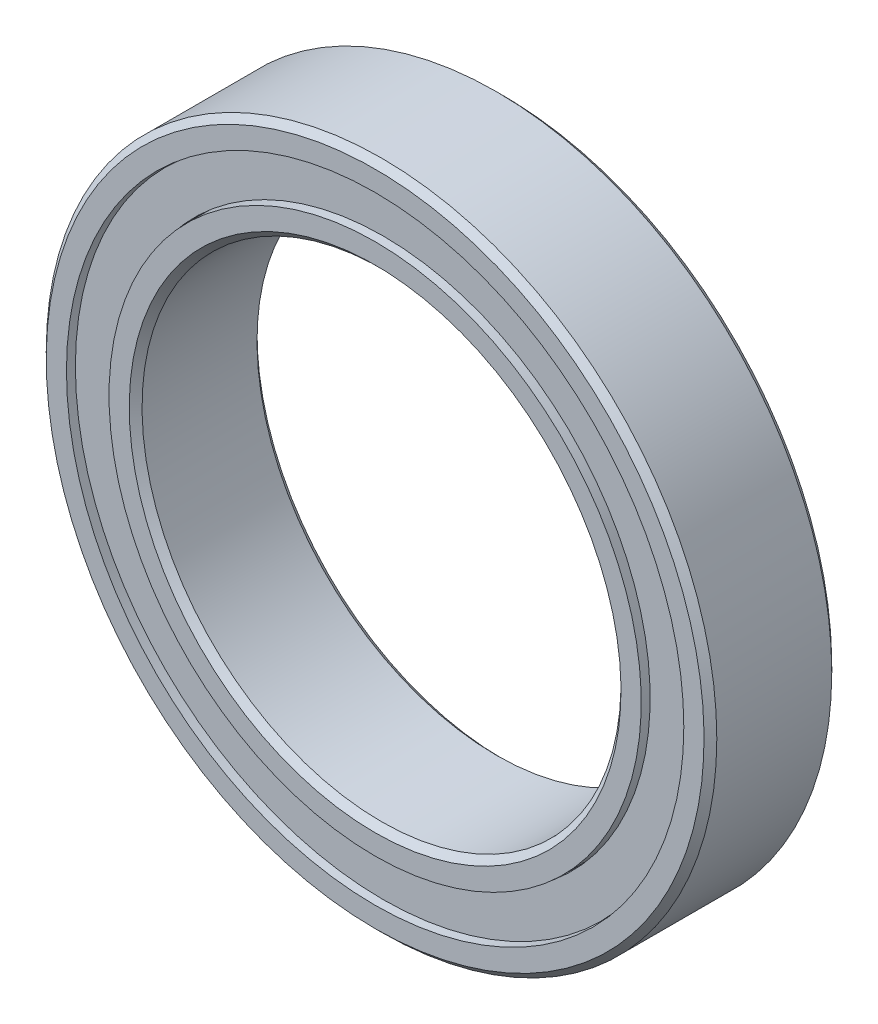
ISO-10303-21;
HEADER;
FILE_DESCRIPTION(('STEP AP214'),'2;1');
FILE_NAME('part.step','',(''),(''),'','','');
FILE_SCHEMA(('AUTOMOTIVE_DESIGN { 1 0 10303 214 1 1 1 1 }'));
ENDSEC;
DATA;
#1=APPLICATION_CONTEXT('core data for automotive mechanical design processes');
#2=APPLICATION_PROTOCOL_DEFINITION('international standard','automotive_design',2000,#1);
#3=PRODUCT_CONTEXT('',#1,'mechanical');
#4=PRODUCT('Part','Part','',(#3));
#5=PRODUCT_RELATED_PRODUCT_CATEGORY('part','',(#4));
#6=PRODUCT_DEFINITION_FORMATION('','',#4);
#7=PRODUCT_DEFINITION_CONTEXT('part definition',#1,'design');
#8=PRODUCT_DEFINITION('design','',#6,#7);
#9=PRODUCT_DEFINITION_SHAPE('','',#8);
#10=(LENGTH_UNIT() NAMED_UNIT(*) SI_UNIT(.MILLI.,.METRE.));
#11=(NAMED_UNIT(*) PLANE_ANGLE_UNIT() SI_UNIT($,.RADIAN.));
#12=(NAMED_UNIT(*) SI_UNIT($,.STERADIAN.) SOLID_ANGLE_UNIT());
#13=UNCERTAINTY_MEASURE_WITH_UNIT(LENGTH_MEASURE(1.E-05),#10,'distance_accuracy_value','');
#14=(GEOMETRIC_REPRESENTATION_CONTEXT(3) GLOBAL_UNCERTAINTY_ASSIGNED_CONTEXT((#13)) GLOBAL_UNIT_ASSIGNED_CONTEXT((#10,
#11,#12)) REPRESENTATION_CONTEXT('',''));
#15=CARTESIAN_POINT('',(0.,0.,0.));
#16=DIRECTION('',(0.,0.,1.));
#17=DIRECTION('',(1.,0.,0.));
#18=AXIS2_PLACEMENT_3D('',#15,#16,#17);
#19=CARTESIAN_POINT('',(3.90495365205792,8.10871981112182,0.));
#20=DIRECTION('',(0.,0.,1.));
#21=DIRECTION('',(0.433883739117546,0.900968867902425,0.));
#22=AXIS2_PLACEMENT_3D('',#19,#20,#21);
#23=SPHERICAL_SURFACE('',#22,1.11111111111111);
#24=CARTESIAN_POINT('',(3.90495365205792,8.10871981112182,1.11111111111111));
#25=VERTEX_POINT('',#24);
#26=VERTEX_LOOP('',#25);
#27=FACE_BOUND('',#26,.T.);
#28=ADVANCED_FACE('F37',(#27),#23,.T.);
#29=CLOSED_SHELL('',(#28));
#30=MANIFOLD_SOLID_BREP('B2',#29);
#31=CARTESIAN_POINT('',(7.0364833422122,5.61140821672869,0.));
#32=DIRECTION('',(0.,0.,1.));
#33=DIRECTION('',(0.781831482468022,0.623489801858743,0.));
#34=AXIS2_PLACEMENT_3D('',#31,#32,#33);
#35=SPHERICAL_SURFACE('',#34,1.11111111111111);
#36=CARTESIAN_POINT('',(7.0364833422122,5.61140821672869,1.11111111111111));
#37=VERTEX_POINT('',#36);
#38=VERTEX_LOOP('',#37);
#39=FACE_BOUND('',#38,.T.);
#40=ADVANCED_FACE('F57',(#39),#35,.T.);
#41=CLOSED_SHELL('',(#40));
#42=MANIFOLD_SOLID_BREP('B6',#41);
#43=CARTESIAN_POINT('',(8.77435120963639,2.00268840560692,0.));
#44=DIRECTION('',(0.,0.,1.));
#45=DIRECTION('',(0.974927912181821,0.222520933956325,0.));
#46=AXIS2_PLACEMENT_3D('',#43,#44,#45);
#47=SPHERICAL_SURFACE('',#46,1.11111111111111);
#48=CARTESIAN_POINT('',(8.77435120963639,2.00268840560692,1.11111111111111));
#49=VERTEX_POINT('',#48);
#50=VERTEX_LOOP('',#49);
#51=FACE_BOUND('',#50,.T.);
#52=ADVANCED_FACE('F77',(#51),#47,.T.);
#53=CLOSED_SHELL('',(#52));
#54=MANIFOLD_SOLID_BREP('B33',#53);
#55=CARTESIAN_POINT('',(8.77435120963643,-2.00268840560675,0.));
#56=DIRECTION('',(0.,0.,1.));
#57=DIRECTION('',(0.974927912181826,-0.222520933956305,0.));
#58=AXIS2_PLACEMENT_3D('',#55,#56,#57);
#59=SPHERICAL_SURFACE('',#58,1.11111111111111);
#60=CARTESIAN_POINT('',(8.77435120963643,-2.00268840560675,1.11111111111111));
#61=VERTEX_POINT('',#60);
#62=VERTEX_LOOP('',#61);
#63=FACE_BOUND('',#62,.T.);
#64=ADVANCED_FACE('F97',(#63),#59,.T.);
#65=CLOSED_SHELL('',(#64));
#66=MANIFOLD_SOLID_BREP('B53',#65);
#67=CARTESIAN_POINT('',(7.03648334221232,-5.61140821672854,0.));
#68=DIRECTION('',(0.,0.,1.));
#69=DIRECTION('',(0.781831482468035,-0.623489801858727,0.));
#70=AXIS2_PLACEMENT_3D('',#67,#68,#69);
#71=SPHERICAL_SURFACE('',#70,1.11111111111111);
#72=CARTESIAN_POINT('',(7.03648334221232,-5.61140821672854,1.11111111111111));
#73=VERTEX_POINT('',#72);
#74=VERTEX_LOOP('',#73);
#75=FACE_BOUND('',#74,.T.);
#76=ADVANCED_FACE('F117',(#75),#71,.T.);
#77=CLOSED_SHELL('',(#76));
#78=MANIFOLD_SOLID_BREP('B73',#77);
#79=CARTESIAN_POINT('',(3.90495365205809,-8.10871981112174,0.));
#80=DIRECTION('',(0.,0.,1.));
#81=DIRECTION('',(0.433883739117565,-0.900968867902416,0.));
#82=AXIS2_PLACEMENT_3D('',#79,#80,#81);
#83=SPHERICAL_SURFACE('',#82,1.11111111111111);
#84=CARTESIAN_POINT('',(3.90495365205809,-8.10871981112174,1.11111111111111));
#85=VERTEX_POINT('',#84);
#86=VERTEX_LOOP('',#85);
#87=FACE_BOUND('',#86,.T.);
#88=ADVANCED_FACE('F137',(#87),#83,.T.);
#89=CLOSED_SHELL('',(#88));
#90=MANIFOLD_SOLID_BREP('B93',#89);
#91=CARTESIAN_POINT('',(0.,-9.,0.));
#92=DIRECTION('',(0.,0.,1.));
#93=DIRECTION('',(0.,-1.,0.));
#94=AXIS2_PLACEMENT_3D('',#91,#92,#93);
#95=SPHERICAL_SURFACE('',#94,1.11111111111111);
#96=CARTESIAN_POINT('',(0.,-9.,1.11111111111111));
#97=VERTEX_POINT('',#96);
#98=VERTEX_LOOP('',#97);
#99=FACE_BOUND('',#98,.T.);
#100=ADVANCED_FACE('F157',(#99),#95,.T.);
#101=CLOSED_SHELL('',(#100));
#102=MANIFOLD_SOLID_BREP('B113',#101);
#103=CARTESIAN_POINT('',(-3.90495365205797,-8.1087198111218,0.));
#104=DIRECTION('',(0.,0.,1.));
#105=DIRECTION('',(-0.433883739117553,-0.900968867902422,0.));
#106=AXIS2_PLACEMENT_3D('',#103,#104,#105);
#107=SPHERICAL_SURFACE('',#106,1.11111111111111);
#108=CARTESIAN_POINT('',(-3.90495365205797,-8.1087198111218,1.11111111111111));
#109=VERTEX_POINT('',#108);
#110=VERTEX_LOOP('',#109);
#111=FACE_BOUND('',#110,.T.);
#112=ADVANCED_FACE('F177',(#111),#107,.T.);
#113=CLOSED_SHELL('',(#112));
#114=MANIFOLD_SOLID_BREP('B133',#113);
#115=CARTESIAN_POINT('',(-7.03648334221224,-5.61140821672864,0.));
#116=DIRECTION('',(0.,0.,1.));
#117=DIRECTION('',(-0.781831482468027,-0.623489801858737,0.));
#118=AXIS2_PLACEMENT_3D('',#115,#116,#117);
#119=SPHERICAL_SURFACE('',#118,1.11111111111111);
#120=CARTESIAN_POINT('',(-7.03648334221224,-5.61140821672864,1.11111111111111));
#121=VERTEX_POINT('',#120);
#122=VERTEX_LOOP('',#121);
#123=FACE_BOUND('',#122,.T.);
#124=ADVANCED_FACE('F197',(#123),#119,.T.);
#125=CLOSED_SHELL('',(#124));
#126=MANIFOLD_SOLID_BREP('B153',#125);
#127=CARTESIAN_POINT('',(-8.77435120963641,-2.00268840560686,0.));
#128=DIRECTION('',(0.,0.,1.));
#129=DIRECTION('',(-0.974927912181823,-0.222520933956318,0.));
#130=AXIS2_PLACEMENT_3D('',#127,#128,#129);
#131=SPHERICAL_SURFACE('',#130,1.11111111111111);
#132=CARTESIAN_POINT('',(-8.77435120963641,-2.00268840560686,1.11111111111111));
#133=VERTEX_POINT('',#132);
#134=VERTEX_LOOP('',#133);
#135=FACE_BOUND('',#134,.T.);
#136=ADVANCED_FACE('F217',(#135),#131,.T.);
#137=CLOSED_SHELL('',(#136));
#138=MANIFOLD_SOLID_BREP('B173',#137);
#139=CARTESIAN_POINT('',(-8.77435120963642,2.0026884056068,0.));
#140=DIRECTION('',(0.,0.,1.));
#141=DIRECTION('',(-0.974927912181824,0.222520933956311,0.));
#142=AXIS2_PLACEMENT_3D('',#139,#140,#141);
#143=SPHERICAL_SURFACE('',#142,1.11111111111111);
#144=CARTESIAN_POINT('',(-8.77435120963642,2.0026884056068,1.11111111111111));
#145=VERTEX_POINT('',#144);
#146=VERTEX_LOOP('',#145);
#147=FACE_BOUND('',#146,.T.);
#148=ADVANCED_FACE('F237',(#147),#143,.T.);
#149=CLOSED_SHELL('',(#148));
#150=MANIFOLD_SOLID_BREP('B193',#149);
#151=CARTESIAN_POINT('',(-7.03648334221228,5.61140821672859,0.));
#152=DIRECTION('',(0.,0.,1.));
#153=DIRECTION('',(-0.781831482468031,0.623489801858732,0.));
#154=AXIS2_PLACEMENT_3D('',#151,#152,#153);
#155=SPHERICAL_SURFACE('',#154,1.11111111111111);
#156=CARTESIAN_POINT('',(-7.03648334221228,5.61140821672859,1.11111111111111));
#157=VERTEX_POINT('',#156);
#158=VERTEX_LOOP('',#157);
#159=FACE_BOUND('',#158,.T.);
#160=ADVANCED_FACE('F257',(#159),#155,.T.);
#161=CLOSED_SHELL('',(#160));
#162=MANIFOLD_SOLID_BREP('B213',#161);
#163=CARTESIAN_POINT('',(-3.90495365205803,8.10871981112177,0.));
#164=DIRECTION('',(0.,0.,1.));
#165=DIRECTION('',(-0.433883739117559,0.900968867902419,0.));
#166=AXIS2_PLACEMENT_3D('',#163,#164,#165);
#167=SPHERICAL_SURFACE('',#166,1.11111111111111);
#168=CARTESIAN_POINT('',(-3.90495365205803,8.10871981112177,1.11111111111111));
#169=VERTEX_POINT('',#168);
#170=VERTEX_LOOP('',#169);
#171=FACE_BOUND('',#170,.T.);
#172=ADVANCED_FACE('F277',(#171),#167,.T.);
#173=CLOSED_SHELL('',(#172));
#174=MANIFOLD_SOLID_BREP('B233',#173);
#175=CARTESIAN_POINT('',(0.,9.,0.));
#176=DIRECTION('',(0.,0.,1.));
#177=DIRECTION('',(0.,1.,0.));
#178=AXIS2_PLACEMENT_3D('',#175,#176,#177);
#179=SPHERICAL_SURFACE('',#178,1.11111111111111);
#180=CARTESIAN_POINT('',(0.,9.,1.11111111111111));
#181=VERTEX_POINT('',#180);
#182=VERTEX_LOOP('',#181);
#183=FACE_BOUND('',#182,.T.);
#184=ADVANCED_FACE('F299',(#183),#179,.T.);
#185=CLOSED_SHELL('',(#184));
#186=MANIFOLD_SOLID_BREP('B253',#185);
#187=CARTESIAN_POINT('',(0.,8.33333333333333,2.00000000000002));
#188=DIRECTION('',(0.,0.,-1.));
#189=DIRECTION('',(0.,1.,0.));
#190=AXIS2_PLACEMENT_3D('',#187,#188,#189);
#191=PLANE('',#190);
#192=CARTESIAN_POINT('',(0.,0.,2.00000000000002));
#193=DIRECTION('',(0.,0.,1.));
#194=DIRECTION('',(0.,-1.,0.));
#195=AXIS2_PLACEMENT_3D('',#192,#193,#194);
#196=CIRCLE('',#195,7.7);
#197=CARTESIAN_POINT('',(0.,-7.7,2.00000000000001));
#198=VERTEX_POINT('',#197);
#199=EDGE_CURVE('E347',#198,#198,#196,.T.);
#200=ORIENTED_EDGE('',*,*,#199,.F.);
#201=EDGE_LOOP('',(#200));
#202=FACE_BOUND('',#201,.T.);
#203=CARTESIAN_POINT('',(0.,0.,2.00000000000002));
#204=DIRECTION('',(0.,0.,1.));
#205=DIRECTION('',(0.,-1.,0.));
#206=AXIS2_PLACEMENT_3D('',#203,#204,#205);
#207=CIRCLE('',#206,8.33333333333333);
#208=CARTESIAN_POINT('',(0.,-8.33333333333333,2.00000000000001));
#209=VERTEX_POINT('',#208);
#210=EDGE_CURVE('E298',#209,#209,#207,.T.);
#211=ORIENTED_EDGE('',*,*,#210,.T.);
#212=EDGE_LOOP('',(#211));
#213=FACE_BOUND('',#212,.T.);
#214=ADVANCED_FACE('F319',(#202,#213),#191,.F.);
#215=CARTESIAN_POINT('',(0.,0.,2.00000000000001));
#216=DIRECTION('',(0.,0.,1.));
#217=DIRECTION('',(0.,-1.,0.));
#218=AXIS2_PLACEMENT_3D('',#215,#216,#217);
#219=CYLINDRICAL_SURFACE('',#218,8.33333333333333);
#220=ORIENTED_EDGE('',*,*,#210,.F.);
#221=EDGE_LOOP('',(#220));
#222=FACE_BOUND('',#221,.T.);
#223=CARTESIAN_POINT('',(0.,0.,0.888888888888885));
#224=DIRECTION('',(0.,0.,1.));
#225=DIRECTION('',(0.,-1.,0.));
#226=AXIS2_PLACEMENT_3D('',#223,#224,#225);
#227=CIRCLE('',#226,8.33333333333333);
#228=CARTESIAN_POINT('',(0.,-8.33333333333333,0.888888888888884));
#229=VERTEX_POINT('',#228);
#230=EDGE_CURVE('E325',#229,#229,#227,.T.);
#231=ORIENTED_EDGE('',*,*,#230,.T.);
#232=EDGE_LOOP('',(#231));
#233=FACE_BOUND('',#232,.T.);
#234=ADVANCED_FACE('F354',(#222,#233),#219,.T.);
#235=CARTESIAN_POINT('',(0.,0.,0.));
#236=DIRECTION('',(0.,0.,1.));
#237=DIRECTION('',(0.,-1.,0.));
#238=AXIS2_PLACEMENT_3D('',#235,#236,#237);
#239=TOROIDAL_SURFACE('',#238,9.00000000000001,1.11111111111111);
#240=ORIENTED_EDGE('',*,*,#230,.F.);
#241=EDGE_LOOP('',(#240));
#242=FACE_BOUND('',#241,.T.);
#243=CARTESIAN_POINT('',(0.,0.,-0.888888888888887));
#244=DIRECTION('',(0.,0.,1.));
#245=DIRECTION('',(0.,-1.,0.));
#246=AXIS2_PLACEMENT_3D('',#243,#244,#245);
#247=CIRCLE('',#246,8.33333333333333);
#248=CARTESIAN_POINT('',(0.,-8.33333333333333,-0.888888888888888));
#249=VERTEX_POINT('',#248);
#250=EDGE_CURVE('E329',#249,#249,#247,.T.);
#251=ORIENTED_EDGE('',*,*,#250,.T.);
#252=EDGE_LOOP('',(#251));
#253=FACE_BOUND('',#252,.T.);
#254=ADVANCED_FACE('F358',(#242,#253),#239,.F.);
#255=CARTESIAN_POINT('',(0.,0.,2.00000000000001));
#256=DIRECTION('',(0.,0.,1.));
#257=DIRECTION('',(0.,-1.,0.));
#258=AXIS2_PLACEMENT_3D('',#255,#256,#257);
#259=CYLINDRICAL_SURFACE('',#258,8.33333333333333);
#260=ORIENTED_EDGE('',*,*,#250,.F.);
#261=EDGE_LOOP('',(#260));
#262=FACE_BOUND('',#261,.T.);
#263=CARTESIAN_POINT('',(0.,0.,-2.00000000000002));
#264=DIRECTION('',(0.,0.,1.));
#265=DIRECTION('',(0.,-1.,0.));
#266=AXIS2_PLACEMENT_3D('',#263,#264,#265);
#267=CIRCLE('',#266,8.33333333333333);
#268=CARTESIAN_POINT('',(0.,-8.33333333333333,-2.00000000000002));
#269=VERTEX_POINT('',#268);
#270=EDGE_CURVE('E333',#269,#269,#267,.T.);
#271=ORIENTED_EDGE('',*,*,#270,.T.);
#272=EDGE_LOOP('',(#271));
#273=FACE_BOUND('',#272,.T.);
#274=ADVANCED_FACE('F363',(#262,#273),#259,.T.);
#275=CARTESIAN_POINT('',(0.,7.70000000000001,-2.00000000000002));
#276=DIRECTION('',(0.,0.,1.));
#277=DIRECTION('',(0.,-1.,0.));
#278=AXIS2_PLACEMENT_3D('',#275,#276,#277);
#279=PLANE('',#278);
#280=ORIENTED_EDGE('',*,*,#270,.F.);
#281=EDGE_LOOP('',(#280));
#282=FACE_BOUND('',#281,.T.);
#283=CARTESIAN_POINT('',(0.,0.,-2.00000000000002));
#284=DIRECTION('',(0.,0.,1.));
#285=DIRECTION('',(0.,-1.,0.));
#286=AXIS2_PLACEMENT_3D('',#283,#284,#285);
#287=CIRCLE('',#286,7.7);
#288=CARTESIAN_POINT('',(0.,-7.7,-2.00000000000002));
#289=VERTEX_POINT('',#288);
#290=EDGE_CURVE('E338',#289,#289,#287,.T.);
#291=ORIENTED_EDGE('',*,*,#290,.T.);
#292=EDGE_LOOP('',(#291));
#293=FACE_BOUND('',#292,.T.);
#294=ADVANCED_FACE('F369',(#282,#293),#279,.F.);
#295=CARTESIAN_POINT('',(0.,0.,-1.80000000000002));
#296=DIRECTION('',(0.,0.,-1.));
#297=DIRECTION('',(0.,1.,0.));
#298=AXIS2_PLACEMENT_3D('',#295,#296,#297);
#299=CONICAL_SURFACE('',#298,7.5,0.785398163397458);
#300=ORIENTED_EDGE('',*,*,#290,.F.);
#301=EDGE_LOOP('',(#300));
#302=FACE_BOUND('',#301,.T.);
#303=CARTESIAN_POINT('',(0.,0.,-1.80000000000002));
#304=DIRECTION('',(0.,0.,1.));
#305=DIRECTION('',(0.,-1.,0.));
#306=AXIS2_PLACEMENT_3D('',#303,#304,#305);
#307=CIRCLE('',#306,7.5);
#308=CARTESIAN_POINT('',(0.,-7.5,-1.80000000000002));
#309=VERTEX_POINT('',#308);
#310=EDGE_CURVE('E341',#309,#309,#307,.T.);
#311=ORIENTED_EDGE('',*,*,#310,.T.);
#312=EDGE_LOOP('',(#311));
#313=FACE_BOUND('',#312,.T.);
#314=ADVANCED_FACE('F373',(#302,#313),#299,.F.);
#315=CARTESIAN_POINT('',(0.,0.,2.00000000000001));
#316=DIRECTION('',(0.,0.,1.));
#317=DIRECTION('',(0.,-1.,0.));
#318=AXIS2_PLACEMENT_3D('',#315,#316,#317);
#319=CYLINDRICAL_SURFACE('',#318,7.5);
#320=ORIENTED_EDGE('',*,*,#310,.F.);
#321=EDGE_LOOP('',(#320));
#322=FACE_BOUND('',#321,.T.);
#323=CARTESIAN_POINT('',(0.,0.,1.80000000000001));
#324=DIRECTION('',(0.,0.,1.));
#325=DIRECTION('',(0.,-1.,0.));
#326=AXIS2_PLACEMENT_3D('',#323,#324,#325);
#327=CIRCLE('',#326,7.5);
#328=CARTESIAN_POINT('',(0.,-7.5,1.80000000000001));
#329=VERTEX_POINT('',#328);
#330=EDGE_CURVE('E344',#329,#329,#327,.T.);
#331=ORIENTED_EDGE('',*,*,#330,.T.);
#332=EDGE_LOOP('',(#331));
#333=FACE_BOUND('',#332,.T.);
#334=ADVANCED_FACE('F377',(#322,#333),#319,.F.);
#335=CARTESIAN_POINT('',(0.,0.,2.00000000000002));
#336=DIRECTION('',(0.,0.,1.));
#337=DIRECTION('',(0.,-1.,0.));
#338=AXIS2_PLACEMENT_3D('',#335,#336,#337);
#339=CONICAL_SURFACE('',#338,7.7,0.785398163397444);
#340=ORIENTED_EDGE('',*,*,#330,.F.);
#341=EDGE_LOOP('',(#340));
#342=FACE_BOUND('',#341,.T.);
#343=ORIENTED_EDGE('',*,*,#199,.T.);
#344=EDGE_LOOP('',(#343));
#345=FACE_BOUND('',#344,.T.);
#346=ADVANCED_FACE('F351',(#342,#345),#339,.F.);
#347=CLOSED_SHELL('',(#214,#234,#254,#274,#294,#314,#334,#346));
#348=MANIFOLD_SOLID_BREP('B273',#347);
#349=CARTESIAN_POINT('',(0.,8.35873333333334,-1.36505555555557));
#350=DIRECTION('',(0.,0.,-1.));
#351=DIRECTION('',(0.,1.,0.));
#352=AXIS2_PLACEMENT_3D('',#349,#350,#351);
#353=PLANE('',#352);
#354=CARTESIAN_POINT('',(0.,0.,-1.36505555555557));
#355=DIRECTION('',(0.,0.,1.));
#356=DIRECTION('',(0.,-1.,0.));
#357=AXIS2_PLACEMENT_3D('',#354,#355,#356);
#358=CIRCLE('',#357,8.35873333333334);
#359=CARTESIAN_POINT('',(0.,-8.35873333333334,-1.36505555555557));
#360=VERTEX_POINT('',#359);
#361=EDGE_CURVE('E462',#360,#360,#358,.T.);
#362=ORIENTED_EDGE('',*,*,#361,.F.);
#363=EDGE_LOOP('',(#362));
#364=FACE_BOUND('',#363,.T.);
#365=CARTESIAN_POINT('',(0.,0.,-1.36505555555557));
#366=DIRECTION('',(0.,0.,1.));
#367=DIRECTION('',(0.,-1.,0.));
#368=AXIS2_PLACEMENT_3D('',#365,#366,#367);
#369=CIRCLE('',#368,9.64126666666667);
#370=CARTESIAN_POINT('',(0.,-9.64126666666667,-1.36505555555557));
#371=VERTEX_POINT('',#370);
#372=EDGE_CURVE('E318',#371,#371,#369,.T.);
#373=ORIENTED_EDGE('',*,*,#372,.T.);
#374=EDGE_LOOP('',(#373));
#375=FACE_BOUND('',#374,.T.);
#376=ADVANCED_FACE('F448',(#364,#375),#353,.F.);
#377=CARTESIAN_POINT('',(0.,0.,2.00000000000001));
#378=DIRECTION('',(0.,0.,1.));
#379=DIRECTION('',(0.,-1.,0.));
#380=AXIS2_PLACEMENT_3D('',#377,#378,#379);
#381=CYLINDRICAL_SURFACE('',#380,9.64126666666667);
#382=ORIENTED_EDGE('',*,*,#372,.F.);
#383=EDGE_LOOP('',(#382));
#384=FACE_BOUND('',#383,.T.);
#385=CARTESIAN_POINT('',(0.,0.,-1.74605555555557));
#386=DIRECTION('',(0.,0.,1.));
#387=DIRECTION('',(0.,-1.,0.));
#388=AXIS2_PLACEMENT_3D('',#385,#386,#387);
#389=CIRCLE('',#388,9.64126666666667);
#390=CARTESIAN_POINT('',(0.,-9.64126666666667,-1.74605555555557));
#391=VERTEX_POINT('',#390);
#392=EDGE_CURVE('E454',#391,#391,#389,.T.);
#393=ORIENTED_EDGE('',*,*,#392,.T.);
#394=EDGE_LOOP('',(#393));
#395=FACE_BOUND('',#394,.T.);
#396=ADVANCED_FACE('F471',(#384,#395),#381,.T.);
#397=CARTESIAN_POINT('',(0.,8.35873333333334,-1.74605555555557));
#398=DIRECTION('',(0.,0.,1.));
#399=DIRECTION('',(0.,-1.,0.));
#400=AXIS2_PLACEMENT_3D('',#397,#398,#399);
#401=PLANE('',#400);
#402=ORIENTED_EDGE('',*,*,#392,.F.);
#403=EDGE_LOOP('',(#402));
#404=FACE_BOUND('',#403,.T.);
#405=CARTESIAN_POINT('',(0.,0.,-1.74605555555557));
#406=DIRECTION('',(0.,0.,1.));
#407=DIRECTION('',(0.,-1.,0.));
#408=AXIS2_PLACEMENT_3D('',#405,#406,#407);
#409=CIRCLE('',#408,8.35873333333334);
#410=CARTESIAN_POINT('',(0.,-8.35873333333334,-1.74605555555557));
#411=VERTEX_POINT('',#410);
#412=EDGE_CURVE('E458',#411,#411,#409,.T.);
#413=ORIENTED_EDGE('',*,*,#412,.T.);
#414=EDGE_LOOP('',(#413));
#415=FACE_BOUND('',#414,.T.);
#416=ADVANCED_FACE('F475',(#404,#415),#401,.F.);
#417=CARTESIAN_POINT('',(0.,0.,2.00000000000001));
#418=DIRECTION('',(0.,0.,1.));
#419=DIRECTION('',(0.,-1.,0.));
#420=AXIS2_PLACEMENT_3D('',#417,#418,#419);
#421=CYLINDRICAL_SURFACE('',#420,8.35873333333334);
#422=ORIENTED_EDGE('',*,*,#412,.F.);
#423=EDGE_LOOP('',(#422));
#424=FACE_BOUND('',#423,.T.);
#425=ORIENTED_EDGE('',*,*,#361,.T.);
#426=EDGE_LOOP('',(#425));
#427=FACE_BOUND('',#426,.T.);
#428=ADVANCED_FACE('F468',(#424,#427),#421,.F.);
#429=CLOSED_SHELL('',(#376,#396,#416,#428));
#430=MANIFOLD_SOLID_BREP('B293',#429);
#431=CARTESIAN_POINT('',(0.,8.35873333333334,1.74605555555556));
#432=DIRECTION('',(0.,0.,-1.));
#433=DIRECTION('',(0.,1.,0.));
#434=AXIS2_PLACEMENT_3D('',#431,#432,#433);
#435=PLANE('',#434);
#436=CARTESIAN_POINT('',(0.,0.,1.74605555555556));
#437=DIRECTION('',(0.,0.,1.));
#438=DIRECTION('',(0.,-1.,0.));
#439=AXIS2_PLACEMENT_3D('',#436,#437,#438);
#440=CIRCLE('',#439,8.35873333333334);
#441=CARTESIAN_POINT('',(0.,-8.35873333333334,1.74605555555556));
#442=VERTEX_POINT('',#441);
#443=EDGE_CURVE('E447',#442,#442,#440,.T.);
#444=ORIENTED_EDGE('',*,*,#443,.F.);
#445=EDGE_LOOP('',(#444));
#446=FACE_BOUND('',#445,.T.);
#447=CARTESIAN_POINT('',(0.,0.,1.74605555555556));
#448=DIRECTION('',(0.,0.,1.));
#449=DIRECTION('',(0.,-1.,0.));
#450=AXIS2_PLACEMENT_3D('',#447,#448,#449);
#451=CIRCLE('',#450,9.64126666666667);
#452=CARTESIAN_POINT('',(0.,-9.64126666666667,1.74605555555556));
#453=VERTEX_POINT('',#452);
#454=EDGE_CURVE('E530',#453,#453,#451,.T.);
#455=ORIENTED_EDGE('',*,*,#454,.T.);
#456=EDGE_LOOP('',(#455));
#457=FACE_BOUND('',#456,.T.);
#458=ADVANCED_FACE('F516',(#446,#457),#435,.F.);
#459=CARTESIAN_POINT('',(0.,0.,2.00000000000001));
#460=DIRECTION('',(0.,0.,1.));
#461=DIRECTION('',(0.,-1.,0.));
#462=AXIS2_PLACEMENT_3D('',#459,#460,#461);
#463=CYLINDRICAL_SURFACE('',#462,8.35873333333334);
#464=CARTESIAN_POINT('',(0.,0.,1.36505555555556));
#465=DIRECTION('',(0.,0.,1.));
#466=DIRECTION('',(0.,-1.,0.));
#467=AXIS2_PLACEMENT_3D('',#464,#465,#466);
#468=CIRCLE('',#467,8.35873333333334);
#469=CARTESIAN_POINT('',(0.,-8.35873333333334,1.36505555555556));
#470=VERTEX_POINT('',#469);
#471=EDGE_CURVE('E522',#470,#470,#468,.T.);
#472=ORIENTED_EDGE('',*,*,#471,.F.);
#473=EDGE_LOOP('',(#472));
#474=FACE_BOUND('',#473,.T.);
#475=ORIENTED_EDGE('',*,*,#443,.T.);
#476=EDGE_LOOP('',(#475));
#477=FACE_BOUND('',#476,.T.);
#478=ADVANCED_FACE('F545',(#474,#477),#463,.F.);
#479=CARTESIAN_POINT('',(0.,8.35873333333334,1.36505555555556));
#480=DIRECTION('',(0.,0.,1.));
#481=DIRECTION('',(0.,-1.,0.));
#482=AXIS2_PLACEMENT_3D('',#479,#480,#481);
#483=PLANE('',#482);
#484=CARTESIAN_POINT('',(0.,0.,1.36505555555556));
#485=DIRECTION('',(0.,0.,1.));
#486=DIRECTION('',(0.,-1.,0.));
#487=AXIS2_PLACEMENT_3D('',#484,#485,#486);
#488=CIRCLE('',#487,9.64126666666667);
#489=CARTESIAN_POINT('',(0.,-9.64126666666667,1.36505555555556));
#490=VERTEX_POINT('',#489);
#491=EDGE_CURVE('E526',#490,#490,#488,.T.);
#492=ORIENTED_EDGE('',*,*,#491,.F.);
#493=EDGE_LOOP('',(#492));
#494=FACE_BOUND('',#493,.T.);
#495=ORIENTED_EDGE('',*,*,#471,.T.);
#496=EDGE_LOOP('',(#495));
#497=FACE_BOUND('',#496,.T.);
#498=ADVANCED_FACE('F540',(#494,#497),#483,.F.);
#499=CARTESIAN_POINT('',(0.,0.,2.00000000000001));
#500=DIRECTION('',(0.,0.,1.));
#501=DIRECTION('',(0.,-1.,0.));
#502=AXIS2_PLACEMENT_3D('',#499,#500,#501);
#503=CYLINDRICAL_SURFACE('',#502,9.64126666666667);
#504=ORIENTED_EDGE('',*,*,#454,.F.);
#505=EDGE_LOOP('',(#504));
#506=FACE_BOUND('',#505,.T.);
#507=ORIENTED_EDGE('',*,*,#491,.T.);
#508=EDGE_LOOP('',(#507));
#509=FACE_BOUND('',#508,.T.);
#510=ADVANCED_FACE('F537',(#506,#509),#503,.T.);
#511=CLOSED_SHELL('',(#458,#478,#498,#510));
#512=MANIFOLD_SOLID_BREP('B313',#511);
#513=CARTESIAN_POINT('',(0.,0.,1.80000000000001));
#514=DIRECTION('',(0.,0.,-1.));
#515=DIRECTION('',(0.,1.,0.));
#516=AXIS2_PLACEMENT_3D('',#513,#514,#515);
#517=CONICAL_SURFACE('',#516,10.5,0.785398163397462);
#518=CARTESIAN_POINT('',(0.,0.,2.00000000000001));
#519=DIRECTION('',(0.,0.,1.));
#520=DIRECTION('',(0.,-1.,0.));
#521=AXIS2_PLACEMENT_3D('',#518,#519,#520);
#522=CIRCLE('',#521,10.3);
#523=CARTESIAN_POINT('',(0.,-10.3,2.00000000000001));
#524=VERTEX_POINT('',#523);
#525=EDGE_CURVE('E605',#524,#524,#522,.T.);
#526=ORIENTED_EDGE('',*,*,#525,.F.);
#527=EDGE_LOOP('',(#526));
#528=FACE_BOUND('',#527,.T.);
#529=CARTESIAN_POINT('',(0.,0.,1.80000000000001));
#530=DIRECTION('',(0.,0.,1.));
#531=DIRECTION('',(0.,-1.,0.));
#532=AXIS2_PLACEMENT_3D('',#529,#530,#531);
#533=CIRCLE('',#532,10.5);
#534=CARTESIAN_POINT('',(0.,-10.5,1.80000000000001));
#535=VERTEX_POINT('',#534);
#536=EDGE_CURVE('E515',#535,#535,#533,.T.);
#537=ORIENTED_EDGE('',*,*,#536,.T.);
#538=EDGE_LOOP('',(#537));
#539=FACE_BOUND('',#538,.T.);
#540=ADVANCED_FACE('F577',(#528,#539),#517,.T.);
#541=CARTESIAN_POINT('',(0.,0.,2.00000000000001));
#542=DIRECTION('',(0.,0.,1.));
#543=DIRECTION('',(0.,-1.,0.));
#544=AXIS2_PLACEMENT_3D('',#541,#542,#543);
#545=CYLINDRICAL_SURFACE('',#544,10.5);
#546=ORIENTED_EDGE('',*,*,#536,.F.);
#547=EDGE_LOOP('',(#546));
#548=FACE_BOUND('',#547,.T.);
#549=CARTESIAN_POINT('',(0.,0.,-1.80000000000002));
#550=DIRECTION('',(0.,0.,1.));
#551=DIRECTION('',(0.,-1.,0.));
#552=AXIS2_PLACEMENT_3D('',#549,#550,#551);
#553=CIRCLE('',#552,10.5);
#554=CARTESIAN_POINT('',(0.,-10.5,-1.80000000000002));
#555=VERTEX_POINT('',#554);
#556=EDGE_CURVE('E583',#555,#555,#553,.T.);
#557=ORIENTED_EDGE('',*,*,#556,.T.);
#558=EDGE_LOOP('',(#557));
#559=FACE_BOUND('',#558,.T.);
#560=ADVANCED_FACE('F612',(#548,#559),#545,.T.);
#561=CARTESIAN_POINT('',(0.,0.,-2.00000000000002));
#562=DIRECTION('',(0.,0.,1.));
#563=DIRECTION('',(0.,-1.,0.));
#564=AXIS2_PLACEMENT_3D('',#561,#562,#563);
#565=CONICAL_SURFACE('',#564,10.3,0.785398163397463);
#566=ORIENTED_EDGE('',*,*,#556,.F.);
#567=EDGE_LOOP('',(#566));
#568=FACE_BOUND('',#567,.T.);
#569=CARTESIAN_POINT('',(0.,0.,-2.00000000000002));
#570=DIRECTION('',(0.,0.,1.));
#571=DIRECTION('',(0.,-1.,0.));
#572=AXIS2_PLACEMENT_3D('',#569,#570,#571);
#573=CIRCLE('',#572,10.3);
#574=CARTESIAN_POINT('',(0.,-10.3,-2.00000000000002));
#575=VERTEX_POINT('',#574);
#576=EDGE_CURVE('E587',#575,#575,#573,.T.);
#577=ORIENTED_EDGE('',*,*,#576,.T.);
#578=EDGE_LOOP('',(#577));
#579=FACE_BOUND('',#578,.T.);
#580=ADVANCED_FACE('F616',(#568,#579),#565,.T.);
#581=CARTESIAN_POINT('',(0.,10.3,-2.00000000000002));
#582=DIRECTION('',(0.,0.,1.));
#583=DIRECTION('',(0.,-1.,0.));
#584=AXIS2_PLACEMENT_3D('',#581,#582,#583);
#585=PLANE('',#584);
#586=ORIENTED_EDGE('',*,*,#576,.F.);
#587=EDGE_LOOP('',(#586));
#588=FACE_BOUND('',#587,.T.);
#589=CARTESIAN_POINT('',(0.,0.,-2.00000000000002));
#590=DIRECTION('',(0.,0.,1.));
#591=DIRECTION('',(0.,-1.,0.));
#592=AXIS2_PLACEMENT_3D('',#589,#590,#591);
#593=CIRCLE('',#592,9.66666666666667);
#594=CARTESIAN_POINT('',(0.,-9.66666666666667,-2.00000000000002));
#595=VERTEX_POINT('',#594);
#596=EDGE_CURVE('E591',#595,#595,#593,.T.);
#597=ORIENTED_EDGE('',*,*,#596,.T.);
#598=EDGE_LOOP('',(#597));
#599=FACE_BOUND('',#598,.T.);
#600=ADVANCED_FACE('F621',(#588,#599),#585,.F.);
#601=CARTESIAN_POINT('',(0.,0.,2.00000000000001));
#602=DIRECTION('',(0.,0.,1.));
#603=DIRECTION('',(0.,-1.,0.));
#604=AXIS2_PLACEMENT_3D('',#601,#602,#603);
#605=CYLINDRICAL_SURFACE('',#604,9.66666666666667);
#606=ORIENTED_EDGE('',*,*,#596,.F.);
#607=EDGE_LOOP('',(#606));
#608=FACE_BOUND('',#607,.T.);
#609=CARTESIAN_POINT('',(0.,0.,-0.888888888888894));
#610=DIRECTION('',(0.,0.,1.));
#611=DIRECTION('',(0.,-1.,0.));
#612=AXIS2_PLACEMENT_3D('',#609,#610,#611);
#613=CIRCLE('',#612,9.66666666666667);
#614=CARTESIAN_POINT('',(0.,-9.66666666666667,-0.888888888888895));
#615=VERTEX_POINT('',#614);
#616=EDGE_CURVE('E596',#615,#615,#613,.T.);
#617=ORIENTED_EDGE('',*,*,#616,.T.);
#618=EDGE_LOOP('',(#617));
#619=FACE_BOUND('',#618,.T.);
#620=ADVANCED_FACE('F627',(#608,#619),#605,.F.);
#621=CARTESIAN_POINT('',(0.,0.,0.));
#622=DIRECTION('',(0.,0.,1.));
#623=DIRECTION('',(0.,-1.,0.));
#624=AXIS2_PLACEMENT_3D('',#621,#622,#623);
#625=TOROIDAL_SURFACE('',#624,9.,1.11111111111111);
#626=ORIENTED_EDGE('',*,*,#616,.F.);
#627=EDGE_LOOP('',(#626));
#628=FACE_BOUND('',#627,.T.);
#629=CARTESIAN_POINT('',(0.,0.,0.888888888888885));
#630=DIRECTION('',(0.,0.,1.));
#631=DIRECTION('',(0.,-1.,0.));
#632=AXIS2_PLACEMENT_3D('',#629,#630,#631);
#633=CIRCLE('',#632,9.66666666666667);
#634=CARTESIAN_POINT('',(0.,-9.66666666666667,0.888888888888883));
#635=VERTEX_POINT('',#634);
#636=EDGE_CURVE('E599',#635,#635,#633,.T.);
#637=ORIENTED_EDGE('',*,*,#636,.T.);
#638=EDGE_LOOP('',(#637));
#639=FACE_BOUND('',#638,.T.);
#640=ADVANCED_FACE('F631',(#628,#639),#625,.F.);
#641=CARTESIAN_POINT('',(0.,0.,2.00000000000001));
#642=DIRECTION('',(0.,0.,1.));
#643=DIRECTION('',(0.,-1.,0.));
#644=AXIS2_PLACEMENT_3D('',#641,#642,#643);
#645=CYLINDRICAL_SURFACE('',#644,9.66666666666667);
#646=ORIENTED_EDGE('',*,*,#636,.F.);
#647=EDGE_LOOP('',(#646));
#648=FACE_BOUND('',#647,.T.);
#649=CARTESIAN_POINT('',(0.,0.,2.00000000000001));
#650=DIRECTION('',(0.,0.,1.));
#651=DIRECTION('',(0.,-1.,0.));
#652=AXIS2_PLACEMENT_3D('',#649,#650,#651);
#653=CIRCLE('',#652,9.66666666666667);
#654=CARTESIAN_POINT('',(0.,-9.66666666666667,2.00000000000001));
#655=VERTEX_POINT('',#654);
#656=EDGE_CURVE('E602',#655,#655,#653,.T.);
#657=ORIENTED_EDGE('',*,*,#656,.T.);
#658=EDGE_LOOP('',(#657));
#659=FACE_BOUND('',#658,.T.);
#660=ADVANCED_FACE('F635',(#648,#659),#645,.F.);
#661=CARTESIAN_POINT('',(0.,10.3,2.00000000000001));
#662=DIRECTION('',(0.,0.,-1.));
#663=DIRECTION('',(0.,1.,0.));
#664=AXIS2_PLACEMENT_3D('',#661,#662,#663);
#665=PLANE('',#664);
#666=ORIENTED_EDGE('',*,*,#656,.F.);
#667=EDGE_LOOP('',(#666));
#668=FACE_BOUND('',#667,.T.);
#669=ORIENTED_EDGE('',*,*,#525,.T.);
#670=EDGE_LOOP('',(#669));
#671=FACE_BOUND('',#670,.T.);
#672=ADVANCED_FACE('F609',(#668,#671),#665,.F.);
#673=CLOSED_SHELL('',(#540,#560,#580,#600,#620,#640,#660,#672));
#674=MANIFOLD_SOLID_BREP('B442',#673);
#675=ADVANCED_BREP_SHAPE_REPRESENTATION('',(#18,#30,#42,#54,#66,#78,#90,#102,#114,#126,#138,
#150,#162,#174,#186,#348,#430,#512,#674),#14);
#676=SHAPE_DEFINITION_REPRESENTATION(#9,#675);
ENDSEC;
END-ISO-10303-21;
